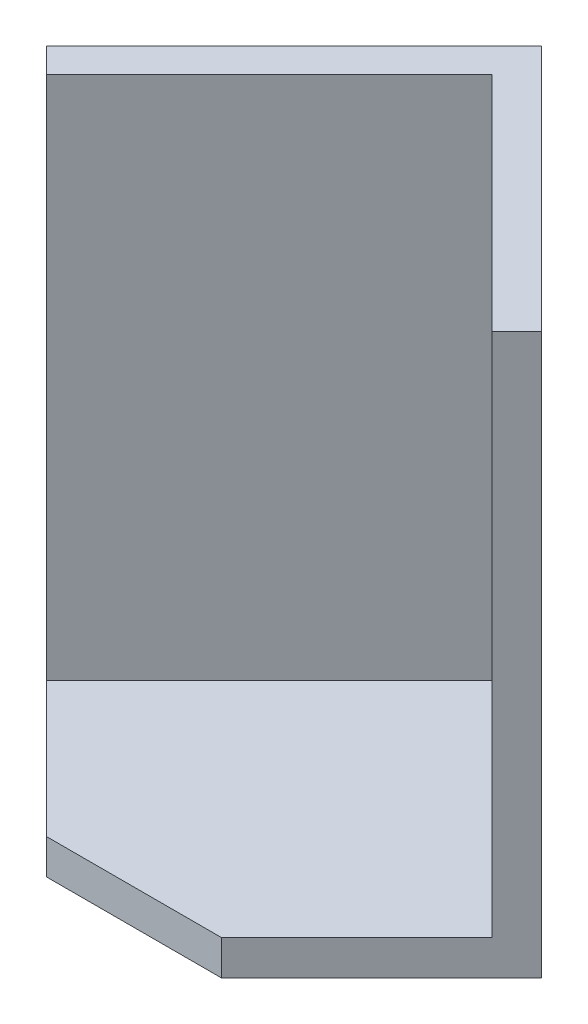
ISO-10303-21;
HEADER;
FILE_DESCRIPTION(('STEP AP214'),'2;1');
FILE_NAME('part.step','',(''),(''),'','','');
FILE_SCHEMA(('AUTOMOTIVE_DESIGN { 1 0 10303 214 1 1 1 1 }'));
ENDSEC;
DATA;
#1=APPLICATION_CONTEXT('core data for automotive mechanical design processes');
#2=APPLICATION_PROTOCOL_DEFINITION('international standard','automotive_design',2000,#1);
#3=PRODUCT_CONTEXT('',#1,'mechanical');
#4=PRODUCT('Part','Part','',(#3));
#5=PRODUCT_RELATED_PRODUCT_CATEGORY('part','',(#4));
#6=PRODUCT_DEFINITION_FORMATION('','',#4);
#7=PRODUCT_DEFINITION_CONTEXT('part definition',#1,'design');
#8=PRODUCT_DEFINITION('design','',#6,#7);
#9=PRODUCT_DEFINITION_SHAPE('','',#8);
#10=(LENGTH_UNIT() NAMED_UNIT(*) SI_UNIT(.MILLI.,.METRE.));
#11=(NAMED_UNIT(*) PLANE_ANGLE_UNIT() SI_UNIT($,.RADIAN.));
#12=(NAMED_UNIT(*) SI_UNIT($,.STERADIAN.) SOLID_ANGLE_UNIT());
#13=UNCERTAINTY_MEASURE_WITH_UNIT(LENGTH_MEASURE(1.E-05),#10,'distance_accuracy_value','');
#14=(GEOMETRIC_REPRESENTATION_CONTEXT(3) GLOBAL_UNCERTAINTY_ASSIGNED_CONTEXT((#13)) GLOBAL_UNIT_ASSIGNED_CONTEXT((#10,
#11,#12)) REPRESENTATION_CONTEXT('',''));
#15=CARTESIAN_POINT('',(0.,0.,0.));
#16=DIRECTION('',(0.,0.,1.));
#17=DIRECTION('',(1.,0.,0.));
#18=AXIS2_PLACEMENT_3D('',#15,#16,#17);
#19=CARTESIAN_POINT('',(0.,80.,40.0822503769998));
#20=DIRECTION('',(0.707106781186551,0.,0.707106781186544));
#21=DIRECTION('',(0.707106781186544,0.,-0.707106781186551));
#22=AXIS2_PLACEMENT_3D('',#19,#20,#21);
#23=PLANE('',#22);
#24=DIRECTION('',(-0.707106781186544,0.,0.707106781186551));
#25=VECTOR('',#24,1.);
#26=CARTESIAN_POINT('',(0.,-80.,40.0822503769998));
#27=LINE('',#26,#25);
#28=CARTESIAN_POINT('',(0.,-80.,40.0822503769998));
#29=VERTEX_POINT('',#28);
#30=CARTESIAN_POINT('',(-70.7106781186544,-80.,110.792928495655));
#31=VERTEX_POINT('',#30);
#32=EDGE_CURVE('E134',#29,#31,#27,.T.);
#33=ORIENTED_EDGE('',*,*,#32,.T.);
#34=DIRECTION('',(0.,-1.,0.));
#35=VECTOR('',#34,1.);
#36=CARTESIAN_POINT('',(-70.7106781186544,80.,110.792928495655));
#37=LINE('',#36,#35);
#38=CARTESIAN_POINT('',(-70.7106781186544,80.,110.792928495655));
#39=VERTEX_POINT('',#38);
#40=EDGE_CURVE('E11',#39,#31,#37,.T.);
#41=ORIENTED_EDGE('',*,*,#40,.F.);
#42=DIRECTION('',(-0.707106781186544,0.,0.707106781186551));
#43=VECTOR('',#42,1.);
#44=CARTESIAN_POINT('',(0.,80.,40.0822503769998));
#45=LINE('',#44,#43);
#46=CARTESIAN_POINT('',(0.,80.,40.0822503769998));
#47=VERTEX_POINT('',#46);
#48=EDGE_CURVE('E146',#47,#39,#45,.T.);
#49=ORIENTED_EDGE('',*,*,#48,.F.);
#50=DIRECTION('',(0.,-1.,0.));
#51=VECTOR('',#50,1.);
#52=CARTESIAN_POINT('',(0.,80.,40.0822503769998));
#53=LINE('',#52,#51);
#54=EDGE_CURVE('E131',#47,#29,#53,.T.);
#55=ORIENTED_EDGE('',*,*,#54,.T.);
#56=EDGE_LOOP('',(#33,#41,#49,#55));
#57=FACE_BOUND('',#56,.T.);
#58=ADVANCED_FACE('F44',(#57),#23,.F.);
#59=CARTESIAN_POINT('',(-70.7106781186544,80.,110.792928495655));
#60=DIRECTION('',(0.707106781186543,0.,-0.707106781186552));
#61=DIRECTION('',(-0.707106781186552,0.,-0.707106781186543));
#62=AXIS2_PLACEMENT_3D('',#59,#60,#61);
#63=PLANE('',#62);
#64=DIRECTION('',(0.707106781186552,0.,0.707106781186543));
#65=VECTOR('',#64,1.);
#66=CARTESIAN_POINT('',(-70.7106781186544,-80.,110.792928495655));
#67=LINE('',#66,#65);
#68=CARTESIAN_POINT('',(-24.9999999999996,-80.,156.503606614309));
#69=VERTEX_POINT('',#68);
#70=EDGE_CURVE('E137',#31,#69,#67,.T.);
#71=ORIENTED_EDGE('',*,*,#70,.T.);
#72=DIRECTION('',(0.,-1.,0.));
#73=VECTOR('',#72,1.);
#74=CARTESIAN_POINT('',(-24.9999999999996,-70.,156.503606614309));
#75=LINE('',#74,#73);
#76=CARTESIAN_POINT('',(-24.9999999999996,-70.,156.503606614309));
#77=VERTEX_POINT('',#76);
#78=EDGE_CURVE('E175',#77,#69,#75,.T.);
#79=ORIENTED_EDGE('',*,*,#78,.F.);
#80=DIRECTION('',(-0.707106781186551,0.,-0.707106781186544));
#81=VECTOR('',#80,1.);
#82=CARTESIAN_POINT('',(-63.6396103067889,-70.,117.86399630752));
#83=LINE('',#82,#81);
#84=CARTESIAN_POINT('',(-63.6396103067889,-70.,117.86399630752));
#85=VERTEX_POINT('',#84);
#86=EDGE_CURVE('E169',#77,#85,#83,.T.);
#87=ORIENTED_EDGE('',*,*,#86,.T.);
#88=DIRECTION('',(0.,-1.,0.));
#89=VECTOR('',#88,1.);
#90=CARTESIAN_POINT('',(-63.6396103067889,80.,117.86399630752));
#91=LINE('',#90,#89);
#92=CARTESIAN_POINT('',(-63.6396103067889,80.,117.86399630752));
#93=VERTEX_POINT('',#92);
#94=EDGE_CURVE('E52',#93,#85,#91,.T.);
#95=ORIENTED_EDGE('',*,*,#94,.F.);
#96=DIRECTION('',(0.707106781186552,0.,0.707106781186543));
#97=VECTOR('',#96,1.);
#98=CARTESIAN_POINT('',(-70.7106781186544,80.,110.792928495655));
#99=LINE('',#98,#97);
#100=EDGE_CURVE('E94',#39,#93,#99,.T.);
#101=ORIENTED_EDGE('',*,*,#100,.F.);
#102=ORIENTED_EDGE('',*,*,#40,.T.);
#103=EDGE_LOOP('',(#71,#79,#87,#95,#101,#102));
#104=FACE_BOUND('',#103,.T.);
#105=ADVANCED_FACE('F167',(#104),#63,.F.);
#106=CARTESIAN_POINT('',(0.,80.,54.2243860007308));
#107=DIRECTION('',(-0.707106781186551,0.,-0.707106781186544));
#108=DIRECTION('',(-0.707106781186544,0.,0.707106781186551));
#109=AXIS2_PLACEMENT_3D('',#106,#107,#108);
#110=PLANE('',#109);
#111=ORIENTED_EDGE('',*,*,#94,.T.);
#112=DIRECTION('',(0.707106781186544,0.,-0.707106781186551));
#113=VECTOR('',#112,1.);
#114=CARTESIAN_POINT('',(-63.6396103067889,-70.,117.86399630752));
#115=LINE('',#114,#113);
#116=CARTESIAN_POINT('',(0.,-70.,54.2243860007308));
#117=VERTEX_POINT('',#116);
#118=EDGE_CURVE('E161',#85,#117,#115,.T.);
#119=ORIENTED_EDGE('',*,*,#118,.T.);
#120=DIRECTION('',(0.,-1.,0.));
#121=VECTOR('',#120,1.);
#122=CARTESIAN_POINT('',(0.,80.,54.2243860007308));
#123=LINE('',#122,#121);
#124=CARTESIAN_POINT('',(0.,80.,54.2243860007308));
#125=VERTEX_POINT('',#124);
#126=EDGE_CURVE('E125',#125,#117,#123,.T.);
#127=ORIENTED_EDGE('',*,*,#126,.F.);
#128=DIRECTION('',(0.707106781186544,0.,-0.707106781186551));
#129=VECTOR('',#128,1.);
#130=CARTESIAN_POINT('',(0.,80.,54.2243860007308));
#131=LINE('',#130,#129);
#132=EDGE_CURVE('E115',#93,#125,#131,.T.);
#133=ORIENTED_EDGE('',*,*,#132,.F.);
#134=EDGE_LOOP('',(#111,#119,#127,#133));
#135=FACE_BOUND('',#134,.T.);
#136=ADVANCED_FACE('F158',(#135),#110,.F.);
#137=CARTESIAN_POINT('',(0.,80.,54.2243860007308));
#138=DIRECTION('',(0.707106781186551,0.,-0.707106781186544));
#139=DIRECTION('',(-0.707106781186544,0.,-0.707106781186551));
#140=AXIS2_PLACEMENT_3D('',#137,#138,#139);
#141=PLANE('',#140);
#142=ORIENTED_EDGE('',*,*,#126,.T.);
#143=DIRECTION('',(0.70710678118655,0.,0.707106781186544));
#144=VECTOR('',#143,1.);
#145=CARTESIAN_POINT('',(0.,-70.,54.2243860007308));
#146=LINE('',#145,#144);
#147=CARTESIAN_POINT('',(63.6396103067889,-70.,117.86399630752));
#148=VERTEX_POINT('',#147);
#149=EDGE_CURVE('E123',#117,#148,#146,.T.);
#150=ORIENTED_EDGE('',*,*,#149,.T.);
#151=DIRECTION('',(0.,-1.,0.));
#152=VECTOR('',#151,1.);
#153=CARTESIAN_POINT('',(63.6396103067889,80.,117.86399630752));
#154=LINE('',#153,#152);
#155=CARTESIAN_POINT('',(63.6396103067889,80.,117.86399630752));
#156=VERTEX_POINT('',#155);
#157=EDGE_CURVE('E117',#156,#148,#154,.T.);
#158=ORIENTED_EDGE('',*,*,#157,.F.);
#159=DIRECTION('',(0.707106781186544,0.,0.707106781186551));
#160=VECTOR('',#159,1.);
#161=CARTESIAN_POINT('',(0.,80.,54.2243860007308));
#162=LINE('',#161,#160);
#163=EDGE_CURVE('E103',#125,#156,#162,.T.);
#164=ORIENTED_EDGE('',*,*,#163,.F.);
#165=EDGE_LOOP('',(#142,#150,#158,#164));
#166=FACE_BOUND('',#165,.T.);
#167=ADVANCED_FACE('F119',(#166),#141,.F.);
#168=CARTESIAN_POINT('',(70.7106781186544,80.,110.792928495655));
#169=DIRECTION('',(-0.707106781186545,0.,-0.70710678118655));
#170=DIRECTION('',(-0.70710678118655,0.,0.707106781186545));
#171=AXIS2_PLACEMENT_3D('',#168,#169,#170);
#172=PLANE('',#171);
#173=DIRECTION('',(0.70710678118655,0.,-0.707106781186545));
#174=VECTOR('',#173,1.);
#175=CARTESIAN_POINT('',(70.7106781186544,-80.,110.792928495655));
#176=LINE('',#175,#174);
#177=CARTESIAN_POINT('',(25.0000000000004,-80.,156.503606614309));
#178=VERTEX_POINT('',#177);
#179=CARTESIAN_POINT('',(70.7106781186544,-80.,110.792928495655));
#180=VERTEX_POINT('',#179);
#181=EDGE_CURVE('E143',#178,#180,#176,.T.);
#182=ORIENTED_EDGE('',*,*,#181,.T.);
#183=DIRECTION('',(0.,-1.,0.));
#184=VECTOR('',#183,1.);
#185=CARTESIAN_POINT('',(70.7106781186544,80.,110.792928495655));
#186=LINE('',#185,#184);
#187=CARTESIAN_POINT('',(70.7106781186544,80.,110.792928495655));
#188=VERTEX_POINT('',#187);
#189=EDGE_CURVE('E124',#188,#180,#186,.T.);
#190=ORIENTED_EDGE('',*,*,#189,.F.);
#191=DIRECTION('',(0.70710678118655,0.,-0.707106781186545));
#192=VECTOR('',#191,1.);
#193=CARTESIAN_POINT('',(70.7106781186544,80.,110.792928495655));
#194=LINE('',#193,#192);
#195=EDGE_CURVE('E107',#156,#188,#194,.T.);
#196=ORIENTED_EDGE('',*,*,#195,.F.);
#197=ORIENTED_EDGE('',*,*,#157,.T.);
#198=DIRECTION('',(-0.707106781186544,0.,0.707106781186551));
#199=VECTOR('',#198,1.);
#200=CARTESIAN_POINT('',(25.0000000000004,-70.,156.503606614309));
#201=LINE('',#200,#199);
#202=CARTESIAN_POINT('',(25.0000000000004,-70.,156.503606614309));
#203=VERTEX_POINT('',#202);
#204=EDGE_CURVE('E58',#148,#203,#201,.T.);
#205=ORIENTED_EDGE('',*,*,#204,.T.);
#206=DIRECTION('',(0.,-1.,0.));
#207=VECTOR('',#206,1.);
#208=CARTESIAN_POINT('',(25.0000000000004,-70.,156.503606614309));
#209=LINE('',#208,#207);
#210=EDGE_CURVE('E139',#203,#178,#209,.T.);
#211=ORIENTED_EDGE('',*,*,#210,.T.);
#212=EDGE_LOOP('',(#182,#190,#196,#197,#205,#211));
#213=FACE_BOUND('',#212,.T.);
#214=ADVANCED_FACE('F130',(#213),#172,.F.);
#215=CARTESIAN_POINT('',(0.,80.,40.0822503769998));
#216=DIRECTION('',(-0.707106781186551,0.,0.707106781186544));
#217=DIRECTION('',(0.707106781186544,0.,0.707106781186551));
#218=AXIS2_PLACEMENT_3D('',#215,#216,#217);
#219=PLANE('',#218);
#220=DIRECTION('',(-0.707106781186544,0.,-0.707106781186551));
#221=VECTOR('',#220,1.);
#222=CARTESIAN_POINT('',(0.,-80.,40.0822503769998));
#223=LINE('',#222,#221);
#224=EDGE_CURVE('E90',#180,#29,#223,.T.);
#225=ORIENTED_EDGE('',*,*,#224,.T.);
#226=ORIENTED_EDGE('',*,*,#54,.F.);
#227=DIRECTION('',(-0.707106781186544,0.,-0.707106781186551));
#228=VECTOR('',#227,1.);
#229=CARTESIAN_POINT('',(0.,80.,40.0822503769998));
#230=LINE('',#229,#228);
#231=EDGE_CURVE('E69',#188,#47,#230,.T.);
#232=ORIENTED_EDGE('',*,*,#231,.F.);
#233=ORIENTED_EDGE('',*,*,#189,.T.);
#234=EDGE_LOOP('',(#225,#226,#232,#233));
#235=FACE_BOUND('',#234,.T.);
#236=ADVANCED_FACE('F233',(#235),#219,.F.);
#237=CARTESIAN_POINT('',(0.,80.,0.));
#238=DIRECTION('',(0.,1.,0.));
#239=DIRECTION('',(0.,0.,1.));
#240=AXIS2_PLACEMENT_3D('',#237,#238,#239);
#241=PLANE('',#240);
#242=ORIENTED_EDGE('',*,*,#48,.T.);
#243=ORIENTED_EDGE('',*,*,#100,.T.);
#244=ORIENTED_EDGE('',*,*,#132,.T.);
#245=ORIENTED_EDGE('',*,*,#163,.T.);
#246=ORIENTED_EDGE('',*,*,#195,.T.);
#247=ORIENTED_EDGE('',*,*,#231,.T.);
#248=EDGE_LOOP('',(#242,#243,#244,#245,#246,#247));
#249=FACE_BOUND('',#248,.T.);
#250=ADVANCED_FACE('F110',(#249),#241,.T.);
#251=CARTESIAN_POINT('',(0.,-80.,0.));
#252=DIRECTION('',(0.,1.,0.));
#253=DIRECTION('',(0.,0.,1.));
#254=AXIS2_PLACEMENT_3D('',#251,#252,#253);
#255=PLANE('',#254);
#256=ORIENTED_EDGE('',*,*,#32,.F.);
#257=ORIENTED_EDGE('',*,*,#224,.F.);
#258=ORIENTED_EDGE('',*,*,#181,.F.);
#259=DIRECTION('',(-1.,0.,0.));
#260=VECTOR('',#259,1.);
#261=CARTESIAN_POINT('',(-24.9999999999996,-80.,156.503606614309));
#262=LINE('',#261,#260);
#263=EDGE_CURVE('E179',#178,#69,#262,.T.);
#264=ORIENTED_EDGE('',*,*,#263,.T.);
#265=ORIENTED_EDGE('',*,*,#70,.F.);
#266=EDGE_LOOP('',(#256,#257,#258,#264,#265));
#267=FACE_BOUND('',#266,.T.);
#268=ADVANCED_FACE('F209',(#267),#255,.F.);
#269=CARTESIAN_POINT('',(-24.9999999999996,-70.,156.503606614309));
#270=DIRECTION('',(0.,0.,1.));
#271=DIRECTION('',(1.,0.,0.));
#272=AXIS2_PLACEMENT_3D('',#269,#270,#271);
#273=PLANE('',#272);
#274=ORIENTED_EDGE('',*,*,#263,.F.);
#275=ORIENTED_EDGE('',*,*,#210,.F.);
#276=DIRECTION('',(-1.,0.,0.));
#277=VECTOR('',#276,1.);
#278=CARTESIAN_POINT('',(-24.9999999999996,-70.,156.503606614309));
#279=LINE('',#278,#277);
#280=EDGE_CURVE('E172',#203,#77,#279,.T.);
#281=ORIENTED_EDGE('',*,*,#280,.T.);
#282=ORIENTED_EDGE('',*,*,#78,.T.);
#283=EDGE_LOOP('',(#274,#275,#281,#282));
#284=FACE_BOUND('',#283,.T.);
#285=ADVANCED_FACE('F210',(#284),#273,.T.);
#286=CARTESIAN_POINT('',(0.,-70.,0.));
#287=DIRECTION('',(0.,1.,0.));
#288=DIRECTION('',(0.,0.,1.));
#289=AXIS2_PLACEMENT_3D('',#286,#287,#288);
#290=PLANE('',#289);
#291=ORIENTED_EDGE('',*,*,#280,.F.);
#292=ORIENTED_EDGE('',*,*,#204,.F.);
#293=ORIENTED_EDGE('',*,*,#149,.F.);
#294=ORIENTED_EDGE('',*,*,#118,.F.);
#295=ORIENTED_EDGE('',*,*,#86,.F.);
#296=EDGE_LOOP('',(#291,#292,#293,#294,#295));
#297=FACE_BOUND('',#296,.T.);
#298=ADVANCED_FACE('F212',(#297),#290,.T.);
#299=CLOSED_SHELL('',(#58,#105,#136,#167,#214,#236,#250,#268,#285,#298));
#300=MANIFOLD_SOLID_BREP('B2',#299);
#301=ADVANCED_BREP_SHAPE_REPRESENTATION('',(#18,#300),#14);
#302=SHAPE_DEFINITION_REPRESENTATION(#9,#301);
ENDSEC;
END-ISO-10303-21;
